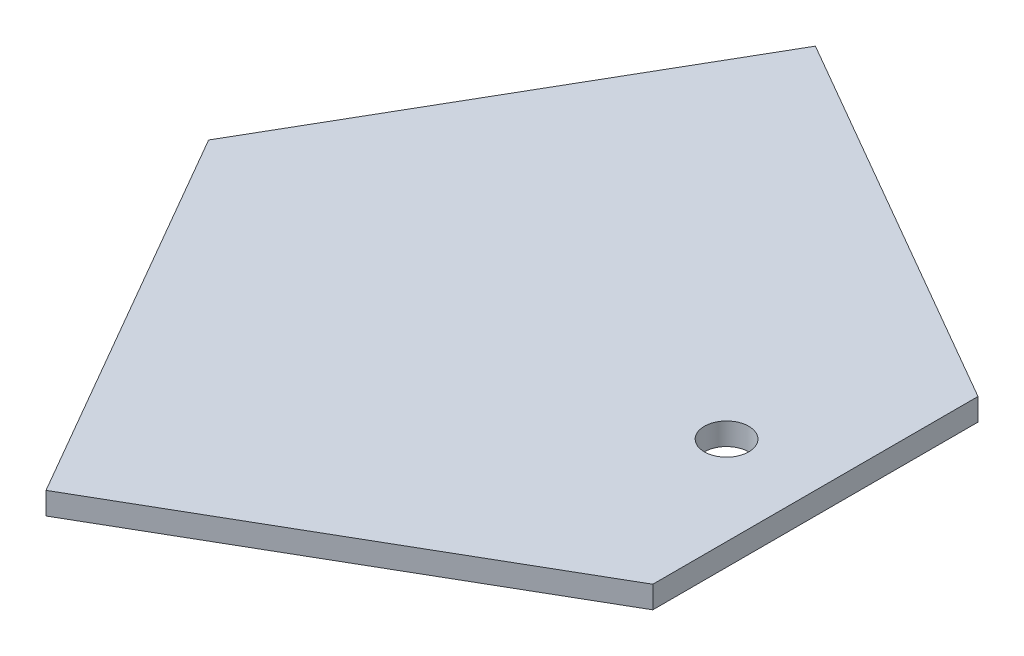
ISO-10303-21;
HEADER;
FILE_DESCRIPTION(('STEP AP214'),'2;1');
FILE_NAME('part.step','',(''),(''),'','','');
FILE_SCHEMA(('AUTOMOTIVE_DESIGN { 1 0 10303 214 1 1 1 1 }'));
ENDSEC;
DATA;
#1=APPLICATION_CONTEXT('core data for automotive mechanical design processes');
#2=APPLICATION_PROTOCOL_DEFINITION('international standard','automotive_design',2000,#1);
#3=PRODUCT_CONTEXT('',#1,'mechanical');
#4=PRODUCT('Part','Part','',(#3));
#5=PRODUCT_RELATED_PRODUCT_CATEGORY('part','',(#4));
#6=PRODUCT_DEFINITION_FORMATION('','',#4);
#7=PRODUCT_DEFINITION_CONTEXT('part definition',#1,'design');
#8=PRODUCT_DEFINITION('design','',#6,#7);
#9=PRODUCT_DEFINITION_SHAPE('','',#8);
#10=(LENGTH_UNIT() NAMED_UNIT(*) SI_UNIT(.MILLI.,.METRE.));
#11=(NAMED_UNIT(*) PLANE_ANGLE_UNIT() SI_UNIT($,.RADIAN.));
#12=(NAMED_UNIT(*) SI_UNIT($,.STERADIAN.) SOLID_ANGLE_UNIT());
#13=UNCERTAINTY_MEASURE_WITH_UNIT(LENGTH_MEASURE(1.E-05),#10,'distance_accuracy_value','');
#14=(GEOMETRIC_REPRESENTATION_CONTEXT(3) GLOBAL_UNCERTAINTY_ASSIGNED_CONTEXT((#13)) GLOBAL_UNIT_ASSIGNED_CONTEXT((#10,
#11,#12)) REPRESENTATION_CONTEXT('',''));
#15=CARTESIAN_POINT('',(0.,0.,0.));
#16=DIRECTION('',(0.,0.,1.));
#17=DIRECTION('',(1.,0.,0.));
#18=AXIS2_PLACEMENT_3D('',#15,#16,#17);
#19=CARTESIAN_POINT('',(50.,5.,-86.6025403784439));
#20=DIRECTION('',(0.866025403784438,0.,0.5));
#21=DIRECTION('',(0.5,0.,-0.866025403784439));
#22=AXIS2_PLACEMENT_3D('',#19,#20,#21);
#23=PLANE('',#22);
#24=DIRECTION('',(-0.5,0.,0.866025403784439));
#25=VECTOR('',#24,1.);
#26=CARTESIAN_POINT('',(50.,0.,-86.6025403784439));
#27=LINE('',#26,#25);
#28=CARTESIAN_POINT('',(50.,0.,-86.6025403784439));
#29=VERTEX_POINT('',#28);
#30=CARTESIAN_POINT('',(0.,0.,0.));
#31=VERTEX_POINT('',#30);
#32=EDGE_CURVE('E111',#29,#31,#27,.T.);
#33=ORIENTED_EDGE('',*,*,#32,.T.);
#34=DIRECTION('',(0.,-1.,0.));
#35=VECTOR('',#34,1.);
#36=CARTESIAN_POINT('',(0.,5.,0.));
#37=LINE('',#36,#35);
#38=CARTESIAN_POINT('',(0.,5.,0.));
#39=VERTEX_POINT('',#38);
#40=EDGE_CURVE('E11',#39,#31,#37,.T.);
#41=ORIENTED_EDGE('',*,*,#40,.F.);
#42=DIRECTION('',(-0.5,0.,0.866025403784439));
#43=VECTOR('',#42,1.);
#44=CARTESIAN_POINT('',(50.,5.,-86.6025403784439));
#45=LINE('',#44,#43);
#46=CARTESIAN_POINT('',(50.,5.,-86.6025403784439));
#47=VERTEX_POINT('',#46);
#48=EDGE_CURVE('E119',#47,#39,#45,.T.);
#49=ORIENTED_EDGE('',*,*,#48,.F.);
#50=DIRECTION('',(0.,-1.,0.));
#51=VECTOR('',#50,1.);
#52=CARTESIAN_POINT('',(50.,5.,-86.6025403784439));
#53=LINE('',#52,#51);
#54=EDGE_CURVE('E107',#47,#29,#53,.T.);
#55=ORIENTED_EDGE('',*,*,#54,.T.);
#56=EDGE_LOOP('',(#33,#41,#49,#55));
#57=FACE_BOUND('',#56,.T.);
#58=ADVANCED_FACE('F36',(#57),#23,.F.);
#59=CARTESIAN_POINT('',(0.,5.,0.));
#60=DIRECTION('',(0.86602540378444,0.,-0.499999999999998));
#61=DIRECTION('',(-0.499999999999998,0.,-0.86602540378444));
#62=AXIS2_PLACEMENT_3D('',#59,#60,#61);
#63=PLANE('',#62);
#64=DIRECTION('',(0.499999999999998,0.,0.86602540378444));
#65=VECTOR('',#64,1.);
#66=CARTESIAN_POINT('',(0.,0.,0.));
#67=LINE('',#66,#65);
#68=CARTESIAN_POINT('',(49.9999999999998,0.,86.602540378444));
#69=VERTEX_POINT('',#68);
#70=EDGE_CURVE('E114',#31,#69,#67,.T.);
#71=ORIENTED_EDGE('',*,*,#70,.T.);
#72=DIRECTION('',(0.,-1.,0.));
#73=VECTOR('',#72,1.);
#74=CARTESIAN_POINT('',(49.9999999999998,5.,86.602540378444));
#75=LINE('',#74,#73);
#76=CARTESIAN_POINT('',(49.9999999999998,5.,86.602540378444));
#77=VERTEX_POINT('',#76);
#78=EDGE_CURVE('E45',#77,#69,#75,.T.);
#79=ORIENTED_EDGE('',*,*,#78,.F.);
#80=DIRECTION('',(0.499999999999998,0.,0.86602540378444));
#81=VECTOR('',#80,1.);
#82=CARTESIAN_POINT('',(0.,5.,0.));
#83=LINE('',#82,#81);
#84=EDGE_CURVE('E87',#39,#77,#83,.T.);
#85=ORIENTED_EDGE('',*,*,#84,.F.);
#86=ORIENTED_EDGE('',*,*,#40,.T.);
#87=EDGE_LOOP('',(#71,#79,#85,#86));
#88=FACE_BOUND('',#87,.T.);
#89=ADVANCED_FACE('F140',(#88),#63,.F.);
#90=CARTESIAN_POINT('',(49.9999999999998,5.,86.602540378444));
#91=DIRECTION('',(-0.500000000000003,0.,-0.866025403784437));
#92=DIRECTION('',(-0.866025403784437,0.,0.500000000000003));
#93=AXIS2_PLACEMENT_3D('',#90,#91,#92);
#94=PLANE('',#93);
#95=DIRECTION('',(0.866025403784437,0.,-0.500000000000003));
#96=VECTOR('',#95,1.);
#97=CARTESIAN_POINT('',(49.9999999999998,0.,86.602540378444));
#98=LINE('',#97,#96);
#99=CARTESIAN_POINT('',(136.602540378444,0.,36.6025403784435));
#100=VERTEX_POINT('',#99);
#101=EDGE_CURVE('E102',#69,#100,#98,.T.);
#102=ORIENTED_EDGE('',*,*,#101,.T.);
#103=DIRECTION('',(0.,-1.,0.));
#104=VECTOR('',#103,1.);
#105=CARTESIAN_POINT('',(136.602540378444,5.,36.6025403784435));
#106=LINE('',#105,#104);
#107=CARTESIAN_POINT('',(136.602540378444,5.,36.6025403784435));
#108=VERTEX_POINT('',#107);
#109=EDGE_CURVE('E99',#108,#100,#106,.T.);
#110=ORIENTED_EDGE('',*,*,#109,.F.);
#111=DIRECTION('',(0.866025403784437,0.,-0.500000000000003));
#112=VECTOR('',#111,1.);
#113=CARTESIAN_POINT('',(49.9999999999998,5.,86.602540378444));
#114=LINE('',#113,#112);
#115=EDGE_CURVE('E91',#77,#108,#114,.T.);
#116=ORIENTED_EDGE('',*,*,#115,.F.);
#117=ORIENTED_EDGE('',*,*,#78,.T.);
#118=EDGE_LOOP('',(#102,#110,#116,#117));
#119=FACE_BOUND('',#118,.T.);
#120=ADVANCED_FACE('F100',(#119),#94,.F.);
#121=CARTESIAN_POINT('',(136.602540378444,5.,-36.6025403784438));
#122=DIRECTION('',(-1.,0.,0.));
#123=DIRECTION('',(0.,0.,1.));
#124=AXIS2_PLACEMENT_3D('',#121,#122,#123);
#125=PLANE('',#124);
#126=DIRECTION('',(0.,0.,-1.));
#127=VECTOR('',#126,1.);
#128=CARTESIAN_POINT('',(136.602540378444,0.,-36.6025403784438));
#129=LINE('',#128,#127);
#130=CARTESIAN_POINT('',(136.602540378444,0.,-36.6025403784438));
#131=VERTEX_POINT('',#130);
#132=EDGE_CURVE('E73',#100,#131,#129,.T.);
#133=ORIENTED_EDGE('',*,*,#132,.T.);
#134=DIRECTION('',(0.,-1.,0.));
#135=VECTOR('',#134,1.);
#136=CARTESIAN_POINT('',(136.602540378444,5.,-36.6025403784438));
#137=LINE('',#136,#135);
#138=CARTESIAN_POINT('',(136.602540378444,5.,-36.6025403784438));
#139=VERTEX_POINT('',#138);
#140=EDGE_CURVE('E103',#139,#131,#137,.T.);
#141=ORIENTED_EDGE('',*,*,#140,.F.);
#142=DIRECTION('',(0.,0.,-1.));
#143=VECTOR('',#142,1.);
#144=CARTESIAN_POINT('',(136.602540378444,5.,-36.6025403784438));
#145=LINE('',#144,#143);
#146=EDGE_CURVE('E95',#108,#139,#145,.T.);
#147=ORIENTED_EDGE('',*,*,#146,.F.);
#148=ORIENTED_EDGE('',*,*,#109,.T.);
#149=EDGE_LOOP('',(#133,#141,#147,#148));
#150=FACE_BOUND('',#149,.T.);
#151=ADVANCED_FACE('F105',(#150),#125,.F.);
#152=CARTESIAN_POINT('',(50.,5.,-86.6025403784439));
#153=DIRECTION('',(-0.5,0.,0.866025403784438));
#154=DIRECTION('',(0.866025403784438,0.,0.5));
#155=AXIS2_PLACEMENT_3D('',#152,#153,#154);
#156=PLANE('',#155);
#157=DIRECTION('',(-0.866025403784438,0.,-0.5));
#158=VECTOR('',#157,1.);
#159=CARTESIAN_POINT('',(50.,0.,-86.6025403784439));
#160=LINE('',#159,#158);
#161=EDGE_CURVE('E79',#131,#29,#160,.T.);
#162=ORIENTED_EDGE('',*,*,#161,.T.);
#163=ORIENTED_EDGE('',*,*,#54,.F.);
#164=DIRECTION('',(-0.866025403784438,0.,-0.5));
#165=VECTOR('',#164,1.);
#166=CARTESIAN_POINT('',(50.,5.,-86.6025403784439));
#167=LINE('',#166,#165);
#168=EDGE_CURVE('E53',#139,#47,#167,.T.);
#169=ORIENTED_EDGE('',*,*,#168,.F.);
#170=ORIENTED_EDGE('',*,*,#140,.T.);
#171=EDGE_LOOP('',(#162,#163,#169,#170));
#172=FACE_BOUND('',#171,.T.);
#173=ADVANCED_FACE('F128',(#172),#156,.F.);
#174=CARTESIAN_POINT('',(0.,5.,0.));
#175=DIRECTION('',(0.,1.,0.));
#176=DIRECTION('',(0.,0.,1.));
#177=AXIS2_PLACEMENT_3D('',#174,#175,#176);
#178=PLANE('',#177);
#179=CARTESIAN_POINT('',(116.602540378444,5.,0.));
#180=DIRECTION('',(0.,1.,0.));
#181=DIRECTION('',(0.,0.,1.));
#182=AXIS2_PLACEMENT_3D('',#179,#180,#181);
#183=CIRCLE('',#182,5.);
#184=CARTESIAN_POINT('',(116.602540378444,5.,5.));
#185=VERTEX_POINT('',#184);
#186=EDGE_CURVE('E215',#185,#185,#183,.T.);
#187=ORIENTED_EDGE('',*,*,#186,.F.);
#188=EDGE_LOOP('',(#187));
#189=FACE_BOUND('',#188,.T.);
#190=ORIENTED_EDGE('',*,*,#48,.T.);
#191=ORIENTED_EDGE('',*,*,#84,.T.);
#192=ORIENTED_EDGE('',*,*,#115,.T.);
#193=ORIENTED_EDGE('',*,*,#146,.T.);
#194=ORIENTED_EDGE('',*,*,#168,.T.);
#195=EDGE_LOOP('',(#190,#191,#192,#193,#194));
#196=FACE_BOUND('',#195,.T.);
#197=ADVANCED_FACE('F93',(#189,#196),#178,.T.);
#198=CARTESIAN_POINT('',(0.,0.,0.));
#199=DIRECTION('',(0.,1.,0.));
#200=DIRECTION('',(0.,0.,1.));
#201=AXIS2_PLACEMENT_3D('',#198,#199,#200);
#202=PLANE('',#201);
#203=CARTESIAN_POINT('',(116.602540378444,0.,0.));
#204=DIRECTION('',(0.,1.,0.));
#205=DIRECTION('',(0.,0.,1.));
#206=AXIS2_PLACEMENT_3D('',#203,#204,#205);
#207=CIRCLE('',#206,5.);
#208=CARTESIAN_POINT('',(116.602540378444,0.,5.));
#209=VERTEX_POINT('',#208);
#210=EDGE_CURVE('E39',#209,#209,#207,.T.);
#211=ORIENTED_EDGE('',*,*,#210,.T.);
#212=EDGE_LOOP('',(#211));
#213=FACE_BOUND('',#212,.T.);
#214=ORIENTED_EDGE('',*,*,#32,.F.);
#215=ORIENTED_EDGE('',*,*,#161,.F.);
#216=ORIENTED_EDGE('',*,*,#132,.F.);
#217=ORIENTED_EDGE('',*,*,#101,.F.);
#218=ORIENTED_EDGE('',*,*,#70,.F.);
#219=EDGE_LOOP('',(#214,#215,#216,#217,#218));
#220=FACE_BOUND('',#219,.T.);
#221=ADVANCED_FACE('F124',(#213,#220),#202,.F.);
#222=CARTESIAN_POINT('',(116.602540378444,-5.,0.));
#223=DIRECTION('',(0.,1.,0.));
#224=DIRECTION('',(0.,0.,1.));
#225=AXIS2_PLACEMENT_3D('',#222,#223,#224);
#226=CYLINDRICAL_SURFACE('',#225,5.);
#227=ORIENTED_EDGE('',*,*,#186,.T.);
#228=EDGE_LOOP('',(#227));
#229=FACE_BOUND('',#228,.T.);
#230=ORIENTED_EDGE('',*,*,#210,.F.);
#231=EDGE_LOOP('',(#230));
#232=FACE_BOUND('',#231,.T.);
#233=ADVANCED_FACE('F176',(#229,#232),#226,.F.);
#234=CLOSED_SHELL('',(#58,#89,#120,#151,#173,#197,#221,#233));
#235=MANIFOLD_SOLID_BREP('B2',#234);
#236=ADVANCED_BREP_SHAPE_REPRESENTATION('',(#18,#235),#14);
#237=SHAPE_DEFINITION_REPRESENTATION(#9,#236);
ENDSEC;
END-ISO-10303-21;
